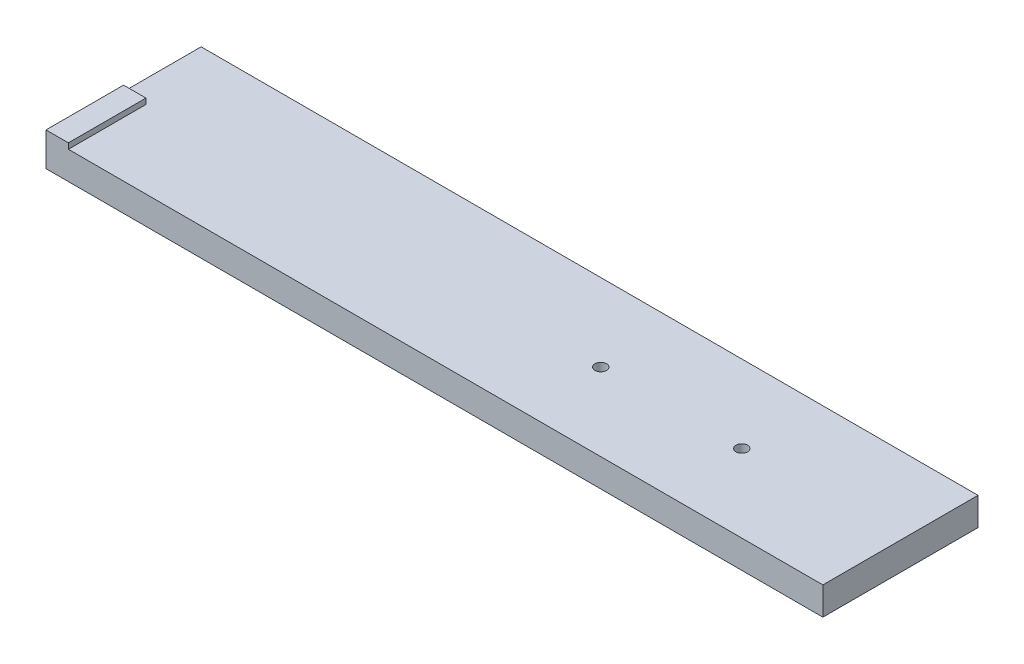
ISO-10303-21;
HEADER;
FILE_DESCRIPTION(('STEP AP214'),'2;1');
FILE_NAME('part.step','',(''),(''),'','','');
FILE_SCHEMA(('AUTOMOTIVE_DESIGN { 1 0 10303 214 1 1 1 1 }'));
ENDSEC;
DATA;
#1=APPLICATION_CONTEXT('core data for automotive mechanical design processes');
#2=APPLICATION_PROTOCOL_DEFINITION('international standard','automotive_design',2000,#1);
#3=PRODUCT_CONTEXT('',#1,'mechanical');
#4=PRODUCT('Part','Part','',(#3));
#5=PRODUCT_RELATED_PRODUCT_CATEGORY('part','',(#4));
#6=PRODUCT_DEFINITION_FORMATION('','',#4);
#7=PRODUCT_DEFINITION_CONTEXT('part definition',#1,'design');
#8=PRODUCT_DEFINITION('design','',#6,#7);
#9=PRODUCT_DEFINITION_SHAPE('','',#8);
#10=(LENGTH_UNIT() NAMED_UNIT(*) SI_UNIT(.MILLI.,.METRE.));
#11=(NAMED_UNIT(*) PLANE_ANGLE_UNIT() SI_UNIT($,.RADIAN.));
#12=(NAMED_UNIT(*) SI_UNIT($,.STERADIAN.) SOLID_ANGLE_UNIT());
#13=UNCERTAINTY_MEASURE_WITH_UNIT(LENGTH_MEASURE(1.E-05),#10,'distance_accuracy_value','');
#14=(GEOMETRIC_REPRESENTATION_CONTEXT(3) GLOBAL_UNCERTAINTY_ASSIGNED_CONTEXT((#13)) GLOBAL_UNIT_ASSIGNED_CONTEXT((#10,
#11,#12)) REPRESENTATION_CONTEXT('',''));
#15=CARTESIAN_POINT('',(0.,0.,0.));
#16=DIRECTION('',(0.,0.,1.));
#17=DIRECTION('',(1.,0.,0.));
#18=AXIS2_PLACEMENT_3D('',#15,#16,#17);
#19=CARTESIAN_POINT('',(0.,7.9375,0.));
#20=DIRECTION('',(0.,-1.,0.));
#21=DIRECTION('',(0.,0.,-1.));
#22=AXIS2_PLACEMENT_3D('',#19,#20,#21);
#23=PLANE('',#22);
#24=CARTESIAN_POINT('',(135.35,7.9375,-22.));
#25=DIRECTION('',(0.,1.,0.));
#26=DIRECTION('',(0.,0.,1.));
#27=AXIS2_PLACEMENT_3D('',#24,#25,#26);
#28=CIRCLE('',#27,1.64999999999998);
#29=CARTESIAN_POINT('',(135.35,7.9375,-20.35));
#30=VERTEX_POINT('',#29);
#31=EDGE_CURVE('E304',#30,#30,#28,.T.);
#32=ORIENTED_EDGE('',*,*,#31,.F.);
#33=EDGE_LOOP('',(#32));
#34=FACE_BOUND('',#33,.T.);
#35=CARTESIAN_POINT('',(175.35,7.9375,-22.));
#36=DIRECTION('',(0.,1.,0.));
#37=DIRECTION('',(0.,0.,1.));
#38=AXIS2_PLACEMENT_3D('',#35,#36,#37);
#39=CIRCLE('',#38,1.64999999999998);
#40=CARTESIAN_POINT('',(175.35,7.9375,-20.35));
#41=VERTEX_POINT('',#40);
#42=EDGE_CURVE('E306',#41,#41,#39,.T.);
#43=ORIENTED_EDGE('',*,*,#42,.F.);
#44=EDGE_LOOP('',(#43));
#45=FACE_BOUND('',#44,.T.);
#46=DIRECTION('',(-1.,0.,0.));
#47=VECTOR('',#46,1.);
#48=CARTESIAN_POINT('',(0.,7.9375,-22.));
#49=LINE('',#48,#47);
#50=CARTESIAN_POINT('',(6.35,7.9375,-22.));
#51=VERTEX_POINT('',#50);
#52=CARTESIAN_POINT('',(0.,7.9375,-22.));
#53=VERTEX_POINT('',#52);
#54=EDGE_CURVE('E120',#51,#53,#49,.T.);
#55=ORIENTED_EDGE('',*,*,#54,.F.);
#56=DIRECTION('',(0.,0.,-1.));
#57=VECTOR('',#56,1.);
#58=CARTESIAN_POINT('',(6.35,7.9375,0.));
#59=LINE('',#58,#57);
#60=CARTESIAN_POINT('',(6.35,7.9375,0.));
#61=VERTEX_POINT('',#60);
#62=EDGE_CURVE('E56',#61,#51,#59,.T.);
#63=ORIENTED_EDGE('',*,*,#62,.F.);
#64=DIRECTION('',(1.,0.,0.));
#65=VECTOR('',#64,1.);
#66=CARTESIAN_POINT('',(0.,7.9375,0.));
#67=LINE('',#66,#65);
#68=CARTESIAN_POINT('',(220.35,7.9375,0.));
#69=VERTEX_POINT('',#68);
#70=EDGE_CURVE('E137',#61,#69,#67,.T.);
#71=ORIENTED_EDGE('',*,*,#70,.T.);
#72=DIRECTION('',(0.,0.,-1.));
#73=VECTOR('',#72,1.);
#74=CARTESIAN_POINT('',(220.35,7.9375,0.));
#75=LINE('',#74,#73);
#76=CARTESIAN_POINT('',(220.35,7.9375,-44.));
#77=VERTEX_POINT('',#76);
#78=EDGE_CURVE('E140',#69,#77,#75,.T.);
#79=ORIENTED_EDGE('',*,*,#78,.T.);
#80=DIRECTION('',(-1.,0.,0.));
#81=VECTOR('',#80,1.);
#82=CARTESIAN_POINT('',(0.,7.9375,-44.));
#83=LINE('',#82,#81);
#84=CARTESIAN_POINT('',(0.,7.9375,-44.));
#85=VERTEX_POINT('',#84);
#86=EDGE_CURVE('E142',#77,#85,#83,.T.);
#87=ORIENTED_EDGE('',*,*,#86,.T.);
#88=DIRECTION('',(0.,0.,1.));
#89=VECTOR('',#88,1.);
#90=CARTESIAN_POINT('',(0.,7.9375,0.));
#91=LINE('',#90,#89);
#92=EDGE_CURVE('E62',#85,#53,#91,.T.);
#93=ORIENTED_EDGE('',*,*,#92,.T.);
#94=EDGE_LOOP('',(#55,#63,#71,#79,#87,#93));
#95=FACE_BOUND('',#94,.T.);
#96=ADVANCED_FACE('F41',(#34,#45,#95),#23,.F.);
#97=CARTESIAN_POINT('',(0.,7.9375,0.));
#98=DIRECTION('',(1.,0.,0.));
#99=DIRECTION('',(0.,0.,-1.));
#100=AXIS2_PLACEMENT_3D('',#97,#98,#99);
#101=PLANE('',#100);
#102=DIRECTION('',(0.,0.,1.));
#103=VECTOR('',#102,1.);
#104=CARTESIAN_POINT('',(0.,0.,0.));
#105=LINE('',#104,#103);
#106=CARTESIAN_POINT('',(0.,0.,-44.));
#107=VERTEX_POINT('',#106);
#108=CARTESIAN_POINT('',(0.,0.,0.));
#109=VERTEX_POINT('',#108);
#110=EDGE_CURVE('E105',#107,#109,#105,.T.);
#111=ORIENTED_EDGE('',*,*,#110,.T.);
#112=DIRECTION('',(0.,-1.,0.));
#113=VECTOR('',#112,1.);
#114=CARTESIAN_POINT('',(0.,7.9375,0.));
#115=LINE('',#114,#113);
#116=CARTESIAN_POINT('',(0.,9.525,0.));
#117=VERTEX_POINT('',#116);
#118=EDGE_CURVE('E11',#117,#109,#115,.T.);
#119=ORIENTED_EDGE('',*,*,#118,.F.);
#120=DIRECTION('',(0.,0.,1.));
#121=VECTOR('',#120,1.);
#122=CARTESIAN_POINT('',(0.,9.525,0.));
#123=LINE('',#122,#121);
#124=CARTESIAN_POINT('',(0.,9.525,-22.));
#125=VERTEX_POINT('',#124);
#126=EDGE_CURVE('E102',#125,#117,#123,.T.);
#127=ORIENTED_EDGE('',*,*,#126,.F.);
#128=DIRECTION('',(0.,-1.,0.));
#129=VECTOR('',#128,1.);
#130=CARTESIAN_POINT('',(0.,9.525,-22.));
#131=LINE('',#130,#129);
#132=EDGE_CURVE('E129',#125,#53,#131,.T.);
#133=ORIENTED_EDGE('',*,*,#132,.T.);
#134=ORIENTED_EDGE('',*,*,#92,.F.);
#135=DIRECTION('',(0.,-1.,0.));
#136=VECTOR('',#135,1.);
#137=CARTESIAN_POINT('',(0.,7.9375,-44.));
#138=LINE('',#137,#136);
#139=EDGE_CURVE('E144',#85,#107,#138,.T.);
#140=ORIENTED_EDGE('',*,*,#139,.T.);
#141=EDGE_LOOP('',(#111,#119,#127,#133,#134,#140));
#142=FACE_BOUND('',#141,.T.);
#143=ADVANCED_FACE('F43',(#142),#101,.F.);
#144=CARTESIAN_POINT('',(0.,7.9375,0.));
#145=DIRECTION('',(0.,0.,-1.));
#146=DIRECTION('',(-1.,0.,0.));
#147=AXIS2_PLACEMENT_3D('',#144,#145,#146);
#148=PLANE('',#147);
#149=DIRECTION('',(1.,0.,0.));
#150=VECTOR('',#149,1.);
#151=CARTESIAN_POINT('',(0.,0.,0.));
#152=LINE('',#151,#150);
#153=CARTESIAN_POINT('',(220.35,0.,0.));
#154=VERTEX_POINT('',#153);
#155=EDGE_CURVE('E146',#109,#154,#152,.T.);
#156=ORIENTED_EDGE('',*,*,#155,.T.);
#157=DIRECTION('',(0.,-1.,0.));
#158=VECTOR('',#157,1.);
#159=CARTESIAN_POINT('',(220.35,7.9375,0.));
#160=LINE('',#159,#158);
#161=EDGE_CURVE('E49',#69,#154,#160,.T.);
#162=ORIENTED_EDGE('',*,*,#161,.F.);
#163=ORIENTED_EDGE('',*,*,#70,.F.);
#164=DIRECTION('',(0.,-1.,0.));
#165=VECTOR('',#164,1.);
#166=CARTESIAN_POINT('',(6.35,9.525,0.));
#167=LINE('',#166,#165);
#168=CARTESIAN_POINT('',(6.35,9.525,0.));
#169=VERTEX_POINT('',#168);
#170=EDGE_CURVE('E111',#169,#61,#167,.T.);
#171=ORIENTED_EDGE('',*,*,#170,.F.);
#172=DIRECTION('',(1.,0.,0.));
#173=VECTOR('',#172,1.);
#174=CARTESIAN_POINT('',(0.,9.525,0.));
#175=LINE('',#174,#173);
#176=EDGE_CURVE('E108',#117,#169,#175,.T.);
#177=ORIENTED_EDGE('',*,*,#176,.F.);
#178=ORIENTED_EDGE('',*,*,#118,.T.);
#179=EDGE_LOOP('',(#156,#162,#163,#171,#177,#178));
#180=FACE_BOUND('',#179,.T.);
#181=ADVANCED_FACE('F109',(#180),#148,.F.);
#182=CARTESIAN_POINT('',(220.35,7.9375,0.));
#183=DIRECTION('',(-1.,0.,0.));
#184=DIRECTION('',(0.,0.,1.));
#185=AXIS2_PLACEMENT_3D('',#182,#183,#184);
#186=PLANE('',#185);
#187=DIRECTION('',(0.,0.,-1.));
#188=VECTOR('',#187,1.);
#189=CARTESIAN_POINT('',(220.35,0.,0.));
#190=LINE('',#189,#188);
#191=CARTESIAN_POINT('',(220.35,0.,-44.));
#192=VERTEX_POINT('',#191);
#193=EDGE_CURVE('E148',#154,#192,#190,.T.);
#194=ORIENTED_EDGE('',*,*,#193,.T.);
#195=DIRECTION('',(0.,-1.,0.));
#196=VECTOR('',#195,1.);
#197=CARTESIAN_POINT('',(220.35,7.9375,-44.));
#198=LINE('',#197,#196);
#199=EDGE_CURVE('E152',#77,#192,#198,.T.);
#200=ORIENTED_EDGE('',*,*,#199,.F.);
#201=ORIENTED_EDGE('',*,*,#78,.F.);
#202=ORIENTED_EDGE('',*,*,#161,.T.);
#203=EDGE_LOOP('',(#194,#200,#201,#202));
#204=FACE_BOUND('',#203,.T.);
#205=ADVANCED_FACE('F159',(#204),#186,.F.);
#206=CARTESIAN_POINT('',(0.,7.9375,-44.));
#207=DIRECTION('',(0.,0.,1.));
#208=DIRECTION('',(1.,0.,0.));
#209=AXIS2_PLACEMENT_3D('',#206,#207,#208);
#210=PLANE('',#209);
#211=DIRECTION('',(-1.,0.,0.));
#212=VECTOR('',#211,1.);
#213=CARTESIAN_POINT('',(0.,0.,-44.));
#214=LINE('',#213,#212);
#215=EDGE_CURVE('E138',#192,#107,#214,.T.);
#216=ORIENTED_EDGE('',*,*,#215,.T.);
#217=ORIENTED_EDGE('',*,*,#139,.F.);
#218=ORIENTED_EDGE('',*,*,#86,.F.);
#219=ORIENTED_EDGE('',*,*,#199,.T.);
#220=EDGE_LOOP('',(#216,#217,#218,#219));
#221=FACE_BOUND('',#220,.T.);
#222=ADVANCED_FACE('F166',(#221),#210,.F.);
#223=CARTESIAN_POINT('',(0.,0.,0.));
#224=DIRECTION('',(0.,-1.,0.));
#225=DIRECTION('',(0.,0.,-1.));
#226=AXIS2_PLACEMENT_3D('',#223,#224,#225);
#227=PLANE('',#226);
#228=CARTESIAN_POINT('',(135.35,0.,-22.));
#229=DIRECTION('',(0.,1.,0.));
#230=DIRECTION('',(0.,0.,1.));
#231=AXIS2_PLACEMENT_3D('',#228,#229,#230);
#232=CIRCLE('',#231,1.64999999999998);
#233=CARTESIAN_POINT('',(135.35,0.,-20.35));
#234=VERTEX_POINT('',#233);
#235=EDGE_CURVE('E302',#234,#234,#232,.T.);
#236=ORIENTED_EDGE('',*,*,#235,.T.);
#237=EDGE_LOOP('',(#236));
#238=FACE_BOUND('',#237,.T.);
#239=CARTESIAN_POINT('',(175.35,0.,-22.));
#240=DIRECTION('',(0.,1.,0.));
#241=DIRECTION('',(0.,0.,1.));
#242=AXIS2_PLACEMENT_3D('',#239,#240,#241);
#243=CIRCLE('',#242,1.64999999999998);
#244=CARTESIAN_POINT('',(175.35,0.,-20.35));
#245=VERTEX_POINT('',#244);
#246=EDGE_CURVE('E124',#245,#245,#243,.T.);
#247=ORIENTED_EDGE('',*,*,#246,.T.);
#248=EDGE_LOOP('',(#247));
#249=FACE_BOUND('',#248,.T.);
#250=ORIENTED_EDGE('',*,*,#110,.F.);
#251=ORIENTED_EDGE('',*,*,#215,.F.);
#252=ORIENTED_EDGE('',*,*,#193,.F.);
#253=ORIENTED_EDGE('',*,*,#155,.F.);
#254=EDGE_LOOP('',(#250,#251,#252,#253));
#255=FACE_BOUND('',#254,.T.);
#256=ADVANCED_FACE('F163',(#238,#249,#255),#227,.T.);
#257=CARTESIAN_POINT('',(6.35,9.525,0.));
#258=DIRECTION('',(-1.,0.,0.));
#259=DIRECTION('',(0.,0.,1.));
#260=AXIS2_PLACEMENT_3D('',#257,#258,#259);
#261=PLANE('',#260);
#262=ORIENTED_EDGE('',*,*,#62,.T.);
#263=DIRECTION('',(0.,-1.,0.));
#264=VECTOR('',#263,1.);
#265=CARTESIAN_POINT('',(6.35,9.525,-22.));
#266=LINE('',#265,#264);
#267=CARTESIAN_POINT('',(6.35,9.525,-22.));
#268=VERTEX_POINT('',#267);
#269=EDGE_CURVE('E132',#268,#51,#266,.T.);
#270=ORIENTED_EDGE('',*,*,#269,.F.);
#271=DIRECTION('',(0.,0.,-1.));
#272=VECTOR('',#271,1.);
#273=CARTESIAN_POINT('',(6.35,9.525,0.));
#274=LINE('',#273,#272);
#275=EDGE_CURVE('E114',#169,#268,#274,.T.);
#276=ORIENTED_EDGE('',*,*,#275,.F.);
#277=ORIENTED_EDGE('',*,*,#170,.T.);
#278=EDGE_LOOP('',(#262,#270,#276,#277));
#279=FACE_BOUND('',#278,.T.);
#280=ADVANCED_FACE('F172',(#279),#261,.F.);
#281=CARTESIAN_POINT('',(0.,9.525,-22.));
#282=DIRECTION('',(0.,0.,1.));
#283=DIRECTION('',(1.,0.,0.));
#284=AXIS2_PLACEMENT_3D('',#281,#282,#283);
#285=PLANE('',#284);
#286=ORIENTED_EDGE('',*,*,#54,.T.);
#287=ORIENTED_EDGE('',*,*,#132,.F.);
#288=DIRECTION('',(-1.,0.,0.));
#289=VECTOR('',#288,1.);
#290=CARTESIAN_POINT('',(0.,9.525,-22.));
#291=LINE('',#290,#289);
#292=EDGE_CURVE('E118',#268,#125,#291,.T.);
#293=ORIENTED_EDGE('',*,*,#292,.F.);
#294=ORIENTED_EDGE('',*,*,#269,.T.);
#295=EDGE_LOOP('',(#286,#287,#293,#294));
#296=FACE_BOUND('',#295,.T.);
#297=ADVANCED_FACE('F169',(#296),#285,.F.);
#298=CARTESIAN_POINT('',(0.,9.525,0.));
#299=DIRECTION('',(0.,-1.,0.));
#300=DIRECTION('',(0.,0.,-1.));
#301=AXIS2_PLACEMENT_3D('',#298,#299,#300);
#302=PLANE('',#301);
#303=ORIENTED_EDGE('',*,*,#126,.T.);
#304=ORIENTED_EDGE('',*,*,#176,.T.);
#305=ORIENTED_EDGE('',*,*,#275,.T.);
#306=ORIENTED_EDGE('',*,*,#292,.T.);
#307=EDGE_LOOP('',(#303,#304,#305,#306));
#308=FACE_BOUND('',#307,.T.);
#309=ADVANCED_FACE('F116',(#308),#302,.F.);
#310=CARTESIAN_POINT('',(175.35,7.9375,-22.));
#311=DIRECTION('',(0.,1.,0.));
#312=DIRECTION('',(0.,0.,1.));
#313=AXIS2_PLACEMENT_3D('',#310,#311,#312);
#314=CYLINDRICAL_SURFACE('',#313,1.64999999999998);
#315=ORIENTED_EDGE('',*,*,#246,.F.);
#316=EDGE_LOOP('',(#315));
#317=FACE_BOUND('',#316,.T.);
#318=ORIENTED_EDGE('',*,*,#42,.T.);
#319=EDGE_LOOP('',(#318));
#320=FACE_BOUND('',#319,.T.);
#321=ADVANCED_FACE('F221',(#317,#320),#314,.F.);
#322=CARTESIAN_POINT('',(135.35,7.9375,-22.));
#323=DIRECTION('',(0.,1.,0.));
#324=DIRECTION('',(0.,0.,1.));
#325=AXIS2_PLACEMENT_3D('',#322,#323,#324);
#326=CYLINDRICAL_SURFACE('',#325,1.64999999999998);
#327=ORIENTED_EDGE('',*,*,#235,.F.);
#328=EDGE_LOOP('',(#327));
#329=FACE_BOUND('',#328,.T.);
#330=ORIENTED_EDGE('',*,*,#31,.T.);
#331=EDGE_LOOP('',(#330));
#332=FACE_BOUND('',#331,.T.);
#333=ADVANCED_FACE('F227',(#329,#332),#326,.F.);
#334=CLOSED_SHELL('',(#96,#143,#181,#205,#222,#256,#280,#297,#309,#321,#333));
#335=MANIFOLD_SOLID_BREP('B2',#334);
#336=ADVANCED_BREP_SHAPE_REPRESENTATION('',(#18,#335),#14);
#337=SHAPE_DEFINITION_REPRESENTATION(#9,#336);
ENDSEC;
END-ISO-10303-21;
